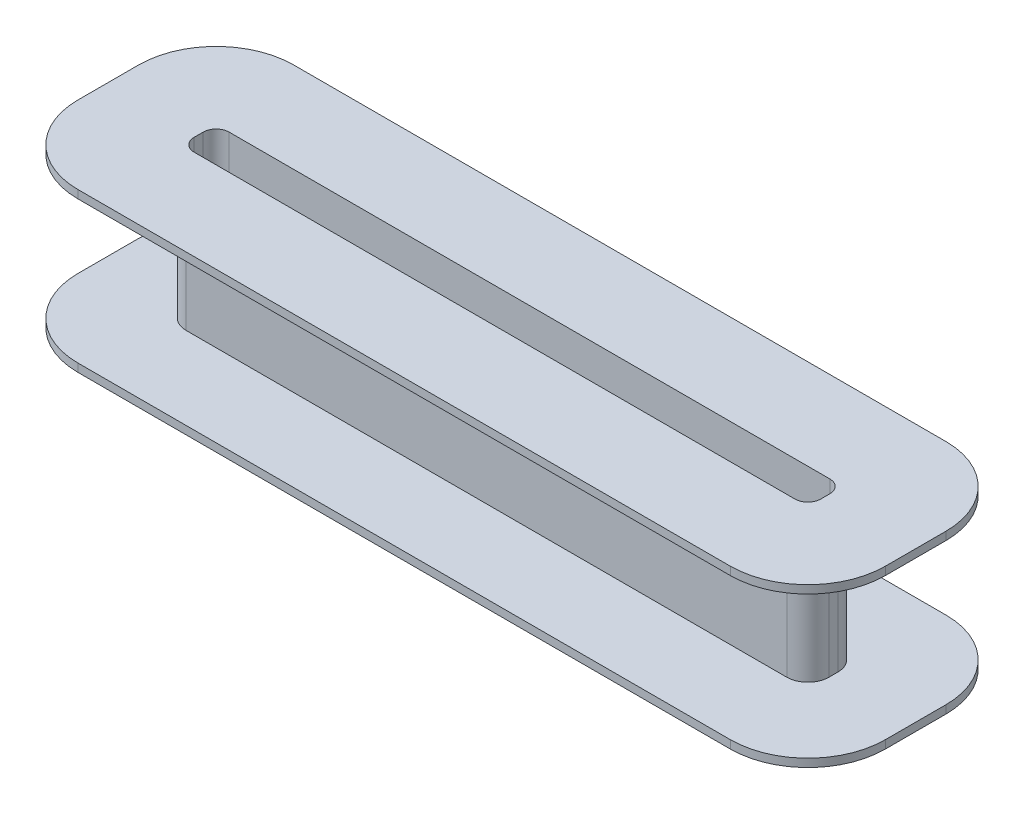
ISO-10303-21;
HEADER;
FILE_DESCRIPTION(('STEP AP214'),'2;1');
FILE_NAME('part.step','',(''),(''),'','','');
FILE_SCHEMA(('AUTOMOTIVE_DESIGN { 1 0 10303 214 1 1 1 1 }'));
ENDSEC;
DATA;
#1=APPLICATION_CONTEXT('core data for automotive mechanical design processes');
#2=APPLICATION_PROTOCOL_DEFINITION('international standard','automotive_design',2000,#1);
#3=PRODUCT_CONTEXT('',#1,'mechanical');
#4=PRODUCT('Part','Part','',(#3));
#5=PRODUCT_RELATED_PRODUCT_CATEGORY('part','',(#4));
#6=PRODUCT_DEFINITION_FORMATION('','',#4);
#7=PRODUCT_DEFINITION_CONTEXT('part definition',#1,'design');
#8=PRODUCT_DEFINITION('design','',#6,#7);
#9=PRODUCT_DEFINITION_SHAPE('','',#8);
#10=(LENGTH_UNIT() NAMED_UNIT(*) SI_UNIT(.MILLI.,.METRE.));
#11=(NAMED_UNIT(*) PLANE_ANGLE_UNIT() SI_UNIT($,.RADIAN.));
#12=(NAMED_UNIT(*) SI_UNIT($,.STERADIAN.) SOLID_ANGLE_UNIT());
#13=UNCERTAINTY_MEASURE_WITH_UNIT(LENGTH_MEASURE(1.E-05),#10,'distance_accuracy_value','');
#14=(GEOMETRIC_REPRESENTATION_CONTEXT(3) GLOBAL_UNCERTAINTY_ASSIGNED_CONTEXT((#13)) GLOBAL_UNIT_ASSIGNED_CONTEXT((#10,
#11,#12)) REPRESENTATION_CONTEXT('',''));
#15=CARTESIAN_POINT('',(0.,0.,0.));
#16=DIRECTION('',(0.,0.,1.));
#17=DIRECTION('',(1.,0.,0.));
#18=AXIS2_PLACEMENT_3D('',#15,#16,#17);
#19=CARTESIAN_POINT('',(0.,0.8,0.));
#20=DIRECTION('',(0.,-1.,0.));
#21=DIRECTION('',(0.,0.,-1.));
#22=AXIS2_PLACEMENT_3D('',#19,#20,#21);
#23=PLANE('',#22);
#24=DIRECTION('',(1.,0.,0.));
#25=VECTOR('',#24,1.);
#26=CARTESIAN_POINT('',(-39.6875,0.8,10.6045));
#27=LINE('',#26,#25);
#28=CARTESIAN_POINT('',(-32.0675,0.8,10.6045));
#29=VERTEX_POINT('',#28);
#30=CARTESIAN_POINT('',(32.0675,0.8,10.6045));
#31=VERTEX_POINT('',#30);
#32=EDGE_CURVE('E429',#29,#31,#27,.T.);
#33=ORIENTED_EDGE('',*,*,#32,.T.);
#34=CARTESIAN_POINT('',(32.0675,0.8,2.9845));
#35=DIRECTION('',(0.,-1.,0.));
#36=DIRECTION('',(0.,0.,-1.));
#37=AXIS2_PLACEMENT_3D('',#34,#35,#36);
#38=CIRCLE('',#37,7.62);
#39=CARTESIAN_POINT('',(39.6875,0.8,2.9845));
#40=VERTEX_POINT('',#39);
#41=EDGE_CURVE('E487',#31,#40,#38,.F.);
#42=ORIENTED_EDGE('',*,*,#41,.T.);
#43=DIRECTION('',(0.,0.,-1.));
#44=VECTOR('',#43,1.);
#45=CARTESIAN_POINT('',(39.6875,0.8,10.6045));
#46=LINE('',#45,#44);
#47=CARTESIAN_POINT('',(39.6875,0.8,-2.9845));
#48=VERTEX_POINT('',#47);
#49=EDGE_CURVE('E419',#40,#48,#46,.T.);
#50=ORIENTED_EDGE('',*,*,#49,.T.);
#51=CARTESIAN_POINT('',(32.0675,0.8,-2.9845));
#52=DIRECTION('',(0.,-1.,0.));
#53=DIRECTION('',(0.,0.,-1.));
#54=AXIS2_PLACEMENT_3D('',#51,#52,#53);
#55=CIRCLE('',#54,7.62);
#56=CARTESIAN_POINT('',(32.0675,0.8,-10.6045));
#57=VERTEX_POINT('',#56);
#58=EDGE_CURVE('E485',#48,#57,#55,.F.);
#59=ORIENTED_EDGE('',*,*,#58,.T.);
#60=DIRECTION('',(-1.,0.,0.));
#61=VECTOR('',#60,1.);
#62=CARTESIAN_POINT('',(-39.6875,0.8,-10.6045));
#63=LINE('',#62,#61);
#64=CARTESIAN_POINT('',(-32.0675,0.8,-10.6045));
#65=VERTEX_POINT('',#64);
#66=EDGE_CURVE('E422',#57,#65,#63,.T.);
#67=ORIENTED_EDGE('',*,*,#66,.T.);
#68=CARTESIAN_POINT('',(-32.0675,0.8,-2.9845));
#69=DIRECTION('',(0.,-1.,0.));
#70=DIRECTION('',(0.,0.,-1.));
#71=AXIS2_PLACEMENT_3D('',#68,#69,#70);
#72=CIRCLE('',#71,7.62);
#73=CARTESIAN_POINT('',(-39.6875,0.8,-2.9845));
#74=VERTEX_POINT('',#73);
#75=EDGE_CURVE('E481',#65,#74,#72,.F.);
#76=ORIENTED_EDGE('',*,*,#75,.T.);
#77=DIRECTION('',(0.,0.,1.));
#78=VECTOR('',#77,1.);
#79=CARTESIAN_POINT('',(-39.6875,0.8,10.6045));
#80=LINE('',#79,#78);
#81=CARTESIAN_POINT('',(-39.6875,0.8,2.9845));
#82=VERTEX_POINT('',#81);
#83=EDGE_CURVE('E426',#74,#82,#80,.T.);
#84=ORIENTED_EDGE('',*,*,#83,.T.);
#85=CARTESIAN_POINT('',(-32.0675,0.8,2.9845));
#86=DIRECTION('',(0.,-1.,0.));
#87=DIRECTION('',(0.,0.,-1.));
#88=AXIS2_PLACEMENT_3D('',#85,#86,#87);
#89=CIRCLE('',#88,7.62);
#90=EDGE_CURVE('E483',#82,#29,#89,.F.);
#91=ORIENTED_EDGE('',*,*,#90,.T.);
#92=EDGE_LOOP('',(#33,#42,#50,#59,#67,#76,#84,#91));
#93=FACE_BOUND('',#92,.T.);
#94=CARTESIAN_POINT('',(29.5275,0.8,-0.444500000000001));
#95=DIRECTION('',(0.,1.,0.));
#96=DIRECTION('',(0.,0.,1.));
#97=AXIS2_PLACEMENT_3D('',#94,#95,#96);
#98=CIRCLE('',#97,2.07);
#99=CARTESIAN_POINT('',(31.5975,0.8,-0.444500000000001));
#100=VERTEX_POINT('',#99);
#101=CARTESIAN_POINT('',(29.5275,0.8,-2.5145));
#102=VERTEX_POINT('',#101);
#103=EDGE_CURVE('E341',#100,#102,#98,.T.);
#104=ORIENTED_EDGE('',*,*,#103,.F.);
#105=DIRECTION('',(0.,0.,-1.));
#106=VECTOR('',#105,1.);
#107=CARTESIAN_POINT('',(31.5975,0.8,0.4445));
#108=LINE('',#107,#106);
#109=CARTESIAN_POINT('',(31.5975,0.8,0.4445));
#110=VERTEX_POINT('',#109);
#111=EDGE_CURVE('E346',#110,#100,#108,.T.);
#112=ORIENTED_EDGE('',*,*,#111,.F.);
#113=CARTESIAN_POINT('',(29.5275,0.8,0.4445));
#114=DIRECTION('',(0.,1.,0.));
#115=DIRECTION('',(0.,0.,1.));
#116=AXIS2_PLACEMENT_3D('',#113,#114,#115);
#117=CIRCLE('',#116,2.07);
#118=CARTESIAN_POINT('',(29.5275,0.8,2.5145));
#119=VERTEX_POINT('',#118);
#120=EDGE_CURVE('E381',#119,#110,#117,.T.);
#121=ORIENTED_EDGE('',*,*,#120,.F.);
#122=DIRECTION('',(1.,0.,0.));
#123=VECTOR('',#122,1.);
#124=CARTESIAN_POINT('',(-29.5275,0.8,2.5145));
#125=LINE('',#124,#123);
#126=CARTESIAN_POINT('',(-29.5275,0.8,2.5145));
#127=VERTEX_POINT('',#126);
#128=EDGE_CURVE('E378',#127,#119,#125,.T.);
#129=ORIENTED_EDGE('',*,*,#128,.F.);
#130=CARTESIAN_POINT('',(-29.5275,0.8,0.4445));
#131=DIRECTION('',(0.,1.,0.));
#132=DIRECTION('',(0.,0.,1.));
#133=AXIS2_PLACEMENT_3D('',#130,#131,#132);
#134=CIRCLE('',#133,2.07);
#135=CARTESIAN_POINT('',(-31.5975,0.8,0.4445));
#136=VERTEX_POINT('',#135);
#137=EDGE_CURVE('E375',#136,#127,#134,.T.);
#138=ORIENTED_EDGE('',*,*,#137,.F.);
#139=DIRECTION('',(0.,0.,1.));
#140=VECTOR('',#139,1.);
#141=CARTESIAN_POINT('',(-31.5975,0.8,-0.444500000000001));
#142=LINE('',#141,#140);
#143=CARTESIAN_POINT('',(-31.5975,0.8,-0.444500000000001));
#144=VERTEX_POINT('',#143);
#145=EDGE_CURVE('E372',#144,#136,#142,.T.);
#146=ORIENTED_EDGE('',*,*,#145,.F.);
#147=CARTESIAN_POINT('',(-29.5275,0.8,-0.444500000000001));
#148=DIRECTION('',(0.,1.,0.));
#149=DIRECTION('',(0.,0.,1.));
#150=AXIS2_PLACEMENT_3D('',#147,#148,#149);
#151=CIRCLE('',#150,2.07);
#152=CARTESIAN_POINT('',(-29.5275,0.8,-2.5145));
#153=VERTEX_POINT('',#152);
#154=EDGE_CURVE('E53',#153,#144,#151,.T.);
#155=ORIENTED_EDGE('',*,*,#154,.F.);
#156=DIRECTION('',(-1.,0.,0.));
#157=VECTOR('',#156,1.);
#158=CARTESIAN_POINT('',(29.5275,0.8,-2.5145));
#159=LINE('',#158,#157);
#160=EDGE_CURVE('E48',#102,#153,#159,.T.);
#161=ORIENTED_EDGE('',*,*,#160,.F.);
#162=EDGE_LOOP('',(#104,#112,#121,#129,#138,#146,#155,#161));
#163=FACE_BOUND('',#162,.T.);
#164=ADVANCED_FACE('F33',(#93,#163),#23,.F.);
#165=CARTESIAN_POINT('',(0.,0.,0.));
#166=DIRECTION('',(0.,-1.,0.));
#167=DIRECTION('',(0.,0.,-1.));
#168=AXIS2_PLACEMENT_3D('',#165,#166,#167);
#169=PLANE('',#168);
#170=DIRECTION('',(0.,0.,-1.));
#171=VECTOR('',#170,1.);
#172=CARTESIAN_POINT('',(39.6875,0.,10.6045));
#173=LINE('',#172,#171);
#174=CARTESIAN_POINT('',(39.6875,0.,2.9845));
#175=VERTEX_POINT('',#174);
#176=CARTESIAN_POINT('',(39.6875,0.,-2.9845));
#177=VERTEX_POINT('',#176);
#178=EDGE_CURVE('E418',#175,#177,#173,.T.);
#179=ORIENTED_EDGE('',*,*,#178,.F.);
#180=CARTESIAN_POINT('',(32.0675,0.,2.9845));
#181=DIRECTION('',(0.,-1.,0.));
#182=DIRECTION('',(0.,0.,-1.));
#183=AXIS2_PLACEMENT_3D('',#180,#181,#182);
#184=CIRCLE('',#183,7.62);
#185=CARTESIAN_POINT('',(32.0675,0.,10.6045));
#186=VERTEX_POINT('',#185);
#187=EDGE_CURVE('E474',#175,#186,#184,.T.);
#188=ORIENTED_EDGE('',*,*,#187,.T.);
#189=DIRECTION('',(1.,0.,0.));
#190=VECTOR('',#189,1.);
#191=CARTESIAN_POINT('',(-39.6875,0.,10.6045));
#192=LINE('',#191,#190);
#193=CARTESIAN_POINT('',(-32.0675,0.,10.6045));
#194=VERTEX_POINT('',#193);
#195=EDGE_CURVE('E423',#194,#186,#192,.T.);
#196=ORIENTED_EDGE('',*,*,#195,.F.);
#197=CARTESIAN_POINT('',(-32.0675,0.,2.9845));
#198=DIRECTION('',(0.,-1.,0.));
#199=DIRECTION('',(0.,0.,-1.));
#200=AXIS2_PLACEMENT_3D('',#197,#198,#199);
#201=CIRCLE('',#200,7.62);
#202=CARTESIAN_POINT('',(-39.6875,0.,2.9845));
#203=VERTEX_POINT('',#202);
#204=EDGE_CURVE('E470',#194,#203,#201,.T.);
#205=ORIENTED_EDGE('',*,*,#204,.T.);
#206=DIRECTION('',(0.,0.,1.));
#207=VECTOR('',#206,1.);
#208=CARTESIAN_POINT('',(-39.6875,0.,10.6045));
#209=LINE('',#208,#207);
#210=CARTESIAN_POINT('',(-39.6875,0.,-2.9845));
#211=VERTEX_POINT('',#210);
#212=EDGE_CURVE('E438',#211,#203,#209,.T.);
#213=ORIENTED_EDGE('',*,*,#212,.F.);
#214=CARTESIAN_POINT('',(-32.0675,0.,-2.9845));
#215=DIRECTION('',(0.,-1.,0.));
#216=DIRECTION('',(0.,0.,-1.));
#217=AXIS2_PLACEMENT_3D('',#214,#215,#216);
#218=CIRCLE('',#217,7.62);
#219=CARTESIAN_POINT('',(-32.0675,0.,-10.6045));
#220=VERTEX_POINT('',#219);
#221=EDGE_CURVE('E468',#211,#220,#218,.T.);
#222=ORIENTED_EDGE('',*,*,#221,.T.);
#223=DIRECTION('',(-1.,0.,0.));
#224=VECTOR('',#223,1.);
#225=CARTESIAN_POINT('',(-39.6875,0.,-10.6045));
#226=LINE('',#225,#224);
#227=CARTESIAN_POINT('',(32.0675,0.,-10.6045));
#228=VERTEX_POINT('',#227);
#229=EDGE_CURVE('E435',#228,#220,#226,.T.);
#230=ORIENTED_EDGE('',*,*,#229,.F.);
#231=CARTESIAN_POINT('',(32.0675,0.,-2.9845));
#232=DIRECTION('',(0.,-1.,0.));
#233=DIRECTION('',(0.,0.,-1.));
#234=AXIS2_PLACEMENT_3D('',#231,#232,#233);
#235=CIRCLE('',#234,7.62);
#236=EDGE_CURVE('E472',#228,#177,#235,.T.);
#237=ORIENTED_EDGE('',*,*,#236,.T.);
#238=EDGE_LOOP('',(#179,#188,#196,#205,#213,#222,#230,#237));
#239=FACE_BOUND('',#238,.T.);
#240=DIRECTION('',(0.,0.,1.));
#241=VECTOR('',#240,1.);
#242=CARTESIAN_POINT('',(-30.7975,0.,1.7145));
#243=LINE('',#242,#241);
#244=CARTESIAN_POINT('',(-30.7975,0.,-0.444500000000001));
#245=VERTEX_POINT('',#244);
#246=CARTESIAN_POINT('',(-30.7975,0.,0.4445));
#247=VERTEX_POINT('',#246);
#248=EDGE_CURVE('E412',#245,#247,#243,.T.);
#249=ORIENTED_EDGE('',*,*,#248,.T.);
#250=CARTESIAN_POINT('',(-29.5275,0.,0.4445));
#251=DIRECTION('',(0.,-1.,0.));
#252=DIRECTION('',(0.,0.,-1.));
#253=AXIS2_PLACEMENT_3D('',#250,#251,#252);
#254=CIRCLE('',#253,1.27);
#255=CARTESIAN_POINT('',(-29.5275,0.,1.7145));
#256=VERTEX_POINT('',#255);
#257=EDGE_CURVE('E461',#247,#256,#254,.F.);
#258=ORIENTED_EDGE('',*,*,#257,.T.);
#259=DIRECTION('',(1.,0.,0.));
#260=VECTOR('',#259,1.);
#261=CARTESIAN_POINT('',(-30.7975,0.,1.7145));
#262=LINE('',#261,#260);
#263=CARTESIAN_POINT('',(29.5275,0.,1.7145));
#264=VERTEX_POINT('',#263);
#265=EDGE_CURVE('E415',#256,#264,#262,.T.);
#266=ORIENTED_EDGE('',*,*,#265,.T.);
#267=CARTESIAN_POINT('',(29.5275,0.,0.4445));
#268=DIRECTION('',(0.,-1.,0.));
#269=DIRECTION('',(0.,0.,-1.));
#270=AXIS2_PLACEMENT_3D('',#267,#268,#269);
#271=CIRCLE('',#270,1.27);
#272=CARTESIAN_POINT('',(30.7975,0.,0.4445));
#273=VERTEX_POINT('',#272);
#274=EDGE_CURVE('E457',#264,#273,#271,.F.);
#275=ORIENTED_EDGE('',*,*,#274,.T.);
#276=DIRECTION('',(0.,0.,-1.));
#277=VECTOR('',#276,1.);
#278=CARTESIAN_POINT('',(30.7975,0.,1.7145));
#279=LINE('',#278,#277);
#280=CARTESIAN_POINT('',(30.7975,0.,-0.444500000000001));
#281=VERTEX_POINT('',#280);
#282=EDGE_CURVE('E408',#273,#281,#279,.T.);
#283=ORIENTED_EDGE('',*,*,#282,.T.);
#284=CARTESIAN_POINT('',(29.5275,0.,-0.444500000000001));
#285=DIRECTION('',(0.,-1.,0.));
#286=DIRECTION('',(0.,0.,-1.));
#287=AXIS2_PLACEMENT_3D('',#284,#285,#286);
#288=CIRCLE('',#287,1.27);
#289=CARTESIAN_POINT('',(29.5275,0.,-1.7145));
#290=VERTEX_POINT('',#289);
#291=EDGE_CURVE('E455',#281,#290,#288,.F.);
#292=ORIENTED_EDGE('',*,*,#291,.T.);
#293=DIRECTION('',(-1.,0.,0.));
#294=VECTOR('',#293,1.);
#295=CARTESIAN_POINT('',(-30.7975,0.,-1.7145));
#296=LINE('',#295,#294);
#297=CARTESIAN_POINT('',(-29.5275,0.,-1.7145));
#298=VERTEX_POINT('',#297);
#299=EDGE_CURVE('E248',#290,#298,#296,.T.);
#300=ORIENTED_EDGE('',*,*,#299,.T.);
#301=CARTESIAN_POINT('',(-29.5275,0.,-0.444500000000001));
#302=DIRECTION('',(0.,-1.,0.));
#303=DIRECTION('',(0.,0.,-1.));
#304=AXIS2_PLACEMENT_3D('',#301,#302,#303);
#305=CIRCLE('',#304,1.27);
#306=EDGE_CURVE('E459',#298,#245,#305,.F.);
#307=ORIENTED_EDGE('',*,*,#306,.T.);
#308=EDGE_LOOP('',(#249,#258,#266,#275,#283,#292,#300,#307));
#309=FACE_BOUND('',#308,.T.);
#310=ADVANCED_FACE('F504',(#239,#309),#169,.T.);
#311=CARTESIAN_POINT('',(39.6875,0.8,10.6045));
#312=DIRECTION('',(-1.,0.,0.));
#313=DIRECTION('',(0.,0.,1.));
#314=AXIS2_PLACEMENT_3D('',#311,#312,#313);
#315=PLANE('',#314);
#316=ORIENTED_EDGE('',*,*,#49,.F.);
#317=DIRECTION('',(0.,-1.,0.));
#318=VECTOR('',#317,1.);
#319=CARTESIAN_POINT('',(39.6875,0.8,2.9845));
#320=LINE('',#319,#318);
#321=EDGE_CURVE('E465',#40,#175,#320,.T.);
#322=ORIENTED_EDGE('',*,*,#321,.T.);
#323=ORIENTED_EDGE('',*,*,#178,.T.);
#324=DIRECTION('',(0.,-1.,0.));
#325=VECTOR('',#324,1.);
#326=CARTESIAN_POINT('',(39.6875,0.8,-2.9845));
#327=LINE('',#326,#325);
#328=EDGE_CURVE('E463',#177,#48,#327,.F.);
#329=ORIENTED_EDGE('',*,*,#328,.T.);
#330=EDGE_LOOP('',(#316,#322,#323,#329));
#331=FACE_BOUND('',#330,.T.);
#332=ADVANCED_FACE('F523',(#331),#315,.F.);
#333=CARTESIAN_POINT('',(-39.6875,0.8,-10.6045));
#334=DIRECTION('',(0.,0.,1.));
#335=DIRECTION('',(1.,0.,0.));
#336=AXIS2_PLACEMENT_3D('',#333,#334,#335);
#337=PLANE('',#336);
#338=ORIENTED_EDGE('',*,*,#66,.F.);
#339=DIRECTION('',(0.,-1.,0.));
#340=VECTOR('',#339,1.);
#341=CARTESIAN_POINT('',(32.0675,0.8,-10.6045));
#342=LINE('',#341,#340);
#343=EDGE_CURVE('E491',#57,#228,#342,.T.);
#344=ORIENTED_EDGE('',*,*,#343,.T.);
#345=ORIENTED_EDGE('',*,*,#229,.T.);
#346=DIRECTION('',(0.,-1.,0.));
#347=VECTOR('',#346,1.);
#348=CARTESIAN_POINT('',(-32.0675,0.8,-10.6045));
#349=LINE('',#348,#347);
#350=EDGE_CURVE('E489',#220,#65,#349,.F.);
#351=ORIENTED_EDGE('',*,*,#350,.T.);
#352=EDGE_LOOP('',(#338,#344,#345,#351));
#353=FACE_BOUND('',#352,.T.);
#354=ADVANCED_FACE('F531',(#353),#337,.F.);
#355=CARTESIAN_POINT('',(-39.6875,0.8,10.6045));
#356=DIRECTION('',(1.,0.,0.));
#357=DIRECTION('',(0.,0.,-1.));
#358=AXIS2_PLACEMENT_3D('',#355,#356,#357);
#359=PLANE('',#358);
#360=ORIENTED_EDGE('',*,*,#212,.T.);
#361=DIRECTION('',(0.,-1.,0.));
#362=VECTOR('',#361,1.);
#363=CARTESIAN_POINT('',(-39.6875,0.8,2.9845));
#364=LINE('',#363,#362);
#365=EDGE_CURVE('E11',#203,#82,#364,.F.);
#366=ORIENTED_EDGE('',*,*,#365,.T.);
#367=ORIENTED_EDGE('',*,*,#83,.F.);
#368=DIRECTION('',(0.,-1.,0.));
#369=VECTOR('',#368,1.);
#370=CARTESIAN_POINT('',(-39.6875,0.8,-2.9845));
#371=LINE('',#370,#369);
#372=EDGE_CURVE('E41',#74,#211,#371,.T.);
#373=ORIENTED_EDGE('',*,*,#372,.T.);
#374=EDGE_LOOP('',(#360,#366,#367,#373));
#375=FACE_BOUND('',#374,.T.);
#376=ADVANCED_FACE('F498',(#375),#359,.F.);
#377=CARTESIAN_POINT('',(-39.6875,0.8,10.6045));
#378=DIRECTION('',(0.,0.,-1.));
#379=DIRECTION('',(-1.,0.,0.));
#380=AXIS2_PLACEMENT_3D('',#377,#378,#379);
#381=PLANE('',#380);
#382=ORIENTED_EDGE('',*,*,#195,.T.);
#383=DIRECTION('',(0.,-1.,0.));
#384=VECTOR('',#383,1.);
#385=CARTESIAN_POINT('',(32.0675,0.8,10.6045));
#386=LINE('',#385,#384);
#387=EDGE_CURVE('E479',#186,#31,#386,.F.);
#388=ORIENTED_EDGE('',*,*,#387,.T.);
#389=ORIENTED_EDGE('',*,*,#32,.F.);
#390=DIRECTION('',(0.,-1.,0.));
#391=VECTOR('',#390,1.);
#392=CARTESIAN_POINT('',(-32.0675,0.8,10.6045));
#393=LINE('',#392,#391);
#394=EDGE_CURVE('E476',#29,#194,#393,.T.);
#395=ORIENTED_EDGE('',*,*,#394,.T.);
#396=EDGE_LOOP('',(#382,#388,#389,#395));
#397=FACE_BOUND('',#396,.T.);
#398=ADVANCED_FACE('F514',(#397),#381,.F.);
#399=CARTESIAN_POINT('',(30.7975,0.8,1.7145));
#400=DIRECTION('',(-1.,0.,0.));
#401=DIRECTION('',(0.,0.,1.));
#402=AXIS2_PLACEMENT_3D('',#399,#400,#401);
#403=PLANE('',#402);
#404=DIRECTION('',(0.,-1.,0.));
#405=VECTOR('',#404,1.);
#406=CARTESIAN_POINT('',(30.7975,0.8,0.4445));
#407=LINE('',#406,#405);
#408=CARTESIAN_POINT('',(30.7975,15.57,0.4445));
#409=VERTEX_POINT('',#408);
#410=EDGE_CURVE('E432',#273,#409,#407,.F.);
#411=ORIENTED_EDGE('',*,*,#410,.T.);
#412=DIRECTION('',(0.,0.,-1.));
#413=VECTOR('',#412,1.);
#414=CARTESIAN_POINT('',(30.7975,15.57,0.4445));
#415=LINE('',#414,#413);
#416=CARTESIAN_POINT('',(30.7975,15.57,-0.444500000000001));
#417=VERTEX_POINT('',#416);
#418=EDGE_CURVE('E281',#409,#417,#415,.T.);
#419=ORIENTED_EDGE('',*,*,#418,.T.);
#420=DIRECTION('',(0.,-1.,0.));
#421=VECTOR('',#420,1.);
#422=CARTESIAN_POINT('',(30.7975,0.,-0.444500000000001));
#423=LINE('',#422,#421);
#424=EDGE_CURVE('E257',#417,#281,#423,.T.);
#425=ORIENTED_EDGE('',*,*,#424,.T.);
#426=ORIENTED_EDGE('',*,*,#282,.F.);
#427=EDGE_LOOP('',(#411,#419,#425,#426));
#428=FACE_BOUND('',#427,.T.);
#429=ADVANCED_FACE('F549',(#428),#403,.T.);
#430=CARTESIAN_POINT('',(-30.7975,0.8,-1.7145));
#431=DIRECTION('',(0.,0.,1.));
#432=DIRECTION('',(1.,0.,0.));
#433=AXIS2_PLACEMENT_3D('',#430,#431,#432);
#434=PLANE('',#433);
#435=ORIENTED_EDGE('',*,*,#299,.F.);
#436=DIRECTION('',(0.,-1.,0.));
#437=VECTOR('',#436,1.);
#438=CARTESIAN_POINT('',(29.5275,0.8,-1.7145));
#439=LINE('',#438,#437);
#440=CARTESIAN_POINT('',(29.5275,15.57,-1.7145));
#441=VERTEX_POINT('',#440);
#442=EDGE_CURVE('E240',#290,#441,#439,.F.);
#443=ORIENTED_EDGE('',*,*,#442,.T.);
#444=DIRECTION('',(-1.,0.,0.));
#445=VECTOR('',#444,1.);
#446=CARTESIAN_POINT('',(29.5275,15.57,-1.7145));
#447=LINE('',#446,#445);
#448=CARTESIAN_POINT('',(-29.5275,15.57,-1.7145));
#449=VERTEX_POINT('',#448);
#450=EDGE_CURVE('E245',#441,#449,#447,.T.);
#451=ORIENTED_EDGE('',*,*,#450,.T.);
#452=DIRECTION('',(0.,-1.,0.));
#453=VECTOR('',#452,1.);
#454=CARTESIAN_POINT('',(-29.5275,0.,-1.7145));
#455=LINE('',#454,#453);
#456=EDGE_CURVE('E251',#449,#298,#455,.T.);
#457=ORIENTED_EDGE('',*,*,#456,.T.);
#458=EDGE_LOOP('',(#435,#443,#451,#457));
#459=FACE_BOUND('',#458,.T.);
#460=ADVANCED_FACE('F242',(#459),#434,.T.);
#461=CARTESIAN_POINT('',(-30.7975,0.8,1.7145));
#462=DIRECTION('',(1.,0.,0.));
#463=DIRECTION('',(0.,0.,-1.));
#464=AXIS2_PLACEMENT_3D('',#461,#462,#463);
#465=PLANE('',#464);
#466=ORIENTED_EDGE('',*,*,#248,.F.);
#467=DIRECTION('',(0.,-1.,0.));
#468=VECTOR('',#467,1.);
#469=CARTESIAN_POINT('',(-30.7975,0.8,-0.444500000000001));
#470=LINE('',#469,#468);
#471=CARTESIAN_POINT('',(-30.7975,15.57,-0.444500000000001));
#472=VERTEX_POINT('',#471);
#473=EDGE_CURVE('E453',#245,#472,#470,.F.);
#474=ORIENTED_EDGE('',*,*,#473,.T.);
#475=DIRECTION('',(0.,0.,1.));
#476=VECTOR('',#475,1.);
#477=CARTESIAN_POINT('',(-30.7975,15.57,-0.444500000000001));
#478=LINE('',#477,#476);
#479=CARTESIAN_POINT('',(-30.7975,15.57,0.4445));
#480=VERTEX_POINT('',#479);
#481=EDGE_CURVE('E267',#472,#480,#478,.T.);
#482=ORIENTED_EDGE('',*,*,#481,.T.);
#483=DIRECTION('',(0.,-1.,0.));
#484=VECTOR('',#483,1.);
#485=CARTESIAN_POINT('',(-30.7975,0.,0.4445));
#486=LINE('',#485,#484);
#487=EDGE_CURVE('E450',#480,#247,#486,.T.);
#488=ORIENTED_EDGE('',*,*,#487,.T.);
#489=EDGE_LOOP('',(#466,#474,#482,#488));
#490=FACE_BOUND('',#489,.T.);
#491=ADVANCED_FACE('F613',(#490),#465,.T.);
#492=CARTESIAN_POINT('',(-30.7975,0.8,1.7145));
#493=DIRECTION('',(0.,0.,-1.));
#494=DIRECTION('',(-1.,0.,0.));
#495=AXIS2_PLACEMENT_3D('',#492,#493,#494);
#496=PLANE('',#495);
#497=DIRECTION('',(0.,-1.,0.));
#498=VECTOR('',#497,1.);
#499=CARTESIAN_POINT('',(-29.5275,0.8,1.7145));
#500=LINE('',#499,#498);
#501=CARTESIAN_POINT('',(-29.5275,15.57,1.7145));
#502=VERTEX_POINT('',#501);
#503=EDGE_CURVE('E250',#256,#502,#500,.F.);
#504=ORIENTED_EDGE('',*,*,#503,.T.);
#505=DIRECTION('',(1.,0.,0.));
#506=VECTOR('',#505,1.);
#507=CARTESIAN_POINT('',(-29.5275,15.57,1.7145));
#508=LINE('',#507,#506);
#509=CARTESIAN_POINT('',(29.5275,15.57,1.7145));
#510=VERTEX_POINT('',#509);
#511=EDGE_CURVE('E275',#502,#510,#508,.T.);
#512=ORIENTED_EDGE('',*,*,#511,.T.);
#513=DIRECTION('',(0.,-1.,0.));
#514=VECTOR('',#513,1.);
#515=CARTESIAN_POINT('',(29.5275,0.,1.7145));
#516=LINE('',#515,#514);
#517=EDGE_CURVE('E447',#510,#264,#516,.T.);
#518=ORIENTED_EDGE('',*,*,#517,.T.);
#519=ORIENTED_EDGE('',*,*,#265,.F.);
#520=EDGE_LOOP('',(#504,#512,#518,#519));
#521=FACE_BOUND('',#520,.T.);
#522=ADVANCED_FACE('F563',(#521),#496,.T.);
#523=CARTESIAN_POINT('',(29.5275,0.8,-0.444500000000001));
#524=DIRECTION('',(0.,1.,0.));
#525=DIRECTION('',(0.,0.,1.));
#526=AXIS2_PLACEMENT_3D('',#523,#524,#525);
#527=CYLINDRICAL_SURFACE('',#526,1.27);
#528=ORIENTED_EDGE('',*,*,#424,.F.);
#529=CARTESIAN_POINT('',(29.5275,15.57,-0.444500000000001));
#530=DIRECTION('',(0.,1.,0.));
#531=DIRECTION('',(0.,0.,1.));
#532=AXIS2_PLACEMENT_3D('',#529,#530,#531);
#533=CIRCLE('',#532,1.27);
#534=EDGE_CURVE('E254',#417,#441,#533,.T.);
#535=ORIENTED_EDGE('',*,*,#534,.T.);
#536=ORIENTED_EDGE('',*,*,#442,.F.);
#537=ORIENTED_EDGE('',*,*,#291,.F.);
#538=EDGE_LOOP('',(#528,#535,#536,#537));
#539=FACE_BOUND('',#538,.T.);
#540=ADVANCED_FACE('F255',(#539),#527,.F.);
#541=CARTESIAN_POINT('',(29.5275,0.8,0.4445));
#542=DIRECTION('',(0.,1.,0.));
#543=DIRECTION('',(0.,0.,1.));
#544=AXIS2_PLACEMENT_3D('',#541,#542,#543);
#545=CYLINDRICAL_SURFACE('',#544,1.27);
#546=ORIENTED_EDGE('',*,*,#517,.F.);
#547=CARTESIAN_POINT('',(29.5275,15.57,0.4445));
#548=DIRECTION('',(0.,1.,0.));
#549=DIRECTION('',(0.,0.,1.));
#550=AXIS2_PLACEMENT_3D('',#547,#548,#549);
#551=CIRCLE('',#550,1.27);
#552=EDGE_CURVE('E278',#510,#409,#551,.T.);
#553=ORIENTED_EDGE('',*,*,#552,.T.);
#554=ORIENTED_EDGE('',*,*,#410,.F.);
#555=ORIENTED_EDGE('',*,*,#274,.F.);
#556=EDGE_LOOP('',(#546,#553,#554,#555));
#557=FACE_BOUND('',#556,.T.);
#558=ADVANCED_FACE('F562',(#557),#545,.F.);
#559=CARTESIAN_POINT('',(-29.5275,0.8,-0.444500000000001));
#560=DIRECTION('',(0.,1.,0.));
#561=DIRECTION('',(0.,0.,1.));
#562=AXIS2_PLACEMENT_3D('',#559,#560,#561);
#563=CYLINDRICAL_SURFACE('',#562,1.27);
#564=ORIENTED_EDGE('',*,*,#456,.F.);
#565=CARTESIAN_POINT('',(-29.5275,15.57,-0.444500000000001));
#566=DIRECTION('',(0.,1.,0.));
#567=DIRECTION('',(0.,0.,1.));
#568=AXIS2_PLACEMENT_3D('',#565,#566,#567);
#569=CIRCLE('',#568,1.27);
#570=EDGE_CURVE('E265',#449,#472,#569,.T.);
#571=ORIENTED_EDGE('',*,*,#570,.T.);
#572=ORIENTED_EDGE('',*,*,#473,.F.);
#573=ORIENTED_EDGE('',*,*,#306,.F.);
#574=EDGE_LOOP('',(#564,#571,#572,#573));
#575=FACE_BOUND('',#574,.T.);
#576=ADVANCED_FACE('F566',(#575),#563,.F.);
#577=CARTESIAN_POINT('',(-29.5275,0.8,0.4445));
#578=DIRECTION('',(0.,1.,0.));
#579=DIRECTION('',(0.,0.,1.));
#580=AXIS2_PLACEMENT_3D('',#577,#578,#579);
#581=CYLINDRICAL_SURFACE('',#580,1.27);
#582=ORIENTED_EDGE('',*,*,#487,.F.);
#583=CARTESIAN_POINT('',(-29.5275,15.57,0.4445));
#584=DIRECTION('',(0.,1.,0.));
#585=DIRECTION('',(0.,0.,1.));
#586=AXIS2_PLACEMENT_3D('',#583,#584,#585);
#587=CIRCLE('',#586,1.27);
#588=EDGE_CURVE('E272',#480,#502,#587,.T.);
#589=ORIENTED_EDGE('',*,*,#588,.T.);
#590=ORIENTED_EDGE('',*,*,#503,.F.);
#591=ORIENTED_EDGE('',*,*,#257,.F.);
#592=EDGE_LOOP('',(#582,#589,#590,#591));
#593=FACE_BOUND('',#592,.T.);
#594=ADVANCED_FACE('F570',(#593),#581,.F.);
#595=CARTESIAN_POINT('',(32.0675,0.8,2.9845));
#596=DIRECTION('',(0.,-1.,0.));
#597=DIRECTION('',(0.,0.,-1.));
#598=AXIS2_PLACEMENT_3D('',#595,#596,#597);
#599=CYLINDRICAL_SURFACE('',#598,7.62);
#600=ORIENTED_EDGE('',*,*,#41,.F.);
#601=ORIENTED_EDGE('',*,*,#387,.F.);
#602=ORIENTED_EDGE('',*,*,#187,.F.);
#603=ORIENTED_EDGE('',*,*,#321,.F.);
#604=EDGE_LOOP('',(#600,#601,#602,#603));
#605=FACE_BOUND('',#604,.T.);
#606=ADVANCED_FACE('F521',(#605),#599,.T.);
#607=CARTESIAN_POINT('',(32.0675,0.8,-2.9845));
#608=DIRECTION('',(0.,-1.,0.));
#609=DIRECTION('',(0.,0.,-1.));
#610=AXIS2_PLACEMENT_3D('',#607,#608,#609);
#611=CYLINDRICAL_SURFACE('',#610,7.62);
#612=ORIENTED_EDGE('',*,*,#58,.F.);
#613=ORIENTED_EDGE('',*,*,#328,.F.);
#614=ORIENTED_EDGE('',*,*,#236,.F.);
#615=ORIENTED_EDGE('',*,*,#343,.F.);
#616=EDGE_LOOP('',(#612,#613,#614,#615));
#617=FACE_BOUND('',#616,.T.);
#618=ADVANCED_FACE('F528',(#617),#611,.T.);
#619=CARTESIAN_POINT('',(-32.0675,0.8,2.9845));
#620=DIRECTION('',(0.,-1.,0.));
#621=DIRECTION('',(0.,0.,-1.));
#622=AXIS2_PLACEMENT_3D('',#619,#620,#621);
#623=CYLINDRICAL_SURFACE('',#622,7.62);
#624=ORIENTED_EDGE('',*,*,#90,.F.);
#625=ORIENTED_EDGE('',*,*,#365,.F.);
#626=ORIENTED_EDGE('',*,*,#204,.F.);
#627=ORIENTED_EDGE('',*,*,#394,.F.);
#628=EDGE_LOOP('',(#624,#625,#626,#627));
#629=FACE_BOUND('',#628,.T.);
#630=ADVANCED_FACE('F511',(#629),#623,.T.);
#631=CARTESIAN_POINT('',(-32.0675,0.8,-2.9845));
#632=DIRECTION('',(0.,-1.,0.));
#633=DIRECTION('',(0.,0.,-1.));
#634=AXIS2_PLACEMENT_3D('',#631,#632,#633);
#635=CYLINDRICAL_SURFACE('',#634,7.62);
#636=ORIENTED_EDGE('',*,*,#75,.F.);
#637=ORIENTED_EDGE('',*,*,#350,.F.);
#638=ORIENTED_EDGE('',*,*,#221,.F.);
#639=ORIENTED_EDGE('',*,*,#372,.F.);
#640=EDGE_LOOP('',(#636,#637,#638,#639));
#641=FACE_BOUND('',#640,.T.);
#642=ADVANCED_FACE('F35',(#641),#635,.T.);
#643=CARTESIAN_POINT('',(29.5275,14.77,-0.444500000000001));
#644=DIRECTION('',(0.,-1.,0.));
#645=DIRECTION('',(0.,0.,-1.));
#646=AXIS2_PLACEMENT_3D('',#643,#644,#645);
#647=CYLINDRICAL_SURFACE('',#646,2.07);
#648=ORIENTED_EDGE('',*,*,#103,.T.);
#649=DIRECTION('',(0.,-1.,0.));
#650=VECTOR('',#649,1.);
#651=CARTESIAN_POINT('',(29.5275,14.77,-2.5145));
#652=LINE('',#651,#650);
#653=CARTESIAN_POINT('',(29.5275,14.77,-2.5145));
#654=VERTEX_POINT('',#653);
#655=EDGE_CURVE('E406',#654,#102,#652,.T.);
#656=ORIENTED_EDGE('',*,*,#655,.F.);
#657=CARTESIAN_POINT('',(29.5275,14.77,-0.444500000000001));
#658=DIRECTION('',(0.,1.,0.));
#659=DIRECTION('',(0.,0.,1.));
#660=AXIS2_PLACEMENT_3D('',#657,#658,#659);
#661=CIRCLE('',#660,2.07);
#662=CARTESIAN_POINT('',(31.5975,14.77,-0.444500000000001));
#663=VERTEX_POINT('',#662);
#664=EDGE_CURVE('E342',#663,#654,#661,.T.);
#665=ORIENTED_EDGE('',*,*,#664,.F.);
#666=DIRECTION('',(0.,-1.,0.));
#667=VECTOR('',#666,1.);
#668=CARTESIAN_POINT('',(31.5975,14.77,-0.444500000000001));
#669=LINE('',#668,#667);
#670=EDGE_CURVE('E367',#663,#100,#669,.T.);
#671=ORIENTED_EDGE('',*,*,#670,.T.);
#672=EDGE_LOOP('',(#648,#656,#665,#671));
#673=FACE_BOUND('',#672,.T.);
#674=ADVANCED_FACE('F534',(#673),#647,.T.);
#675=CARTESIAN_POINT('',(29.5275,14.77,-2.5145));
#676=DIRECTION('',(0.,0.,1.));
#677=DIRECTION('',(1.,0.,0.));
#678=AXIS2_PLACEMENT_3D('',#675,#676,#677);
#679=PLANE('',#678);
#680=ORIENTED_EDGE('',*,*,#160,.T.);
#681=DIRECTION('',(0.,-1.,0.));
#682=VECTOR('',#681,1.);
#683=CARTESIAN_POINT('',(-29.5275,14.77,-2.5145));
#684=LINE('',#683,#682);
#685=CARTESIAN_POINT('',(-29.5275,14.77,-2.5145));
#686=VERTEX_POINT('',#685);
#687=EDGE_CURVE('E403',#686,#153,#684,.T.);
#688=ORIENTED_EDGE('',*,*,#687,.F.);
#689=DIRECTION('',(-1.,0.,0.));
#690=VECTOR('',#689,1.);
#691=CARTESIAN_POINT('',(29.5275,14.77,-2.5145));
#692=LINE('',#691,#690);
#693=EDGE_CURVE('E345',#654,#686,#692,.T.);
#694=ORIENTED_EDGE('',*,*,#693,.F.);
#695=ORIENTED_EDGE('',*,*,#655,.T.);
#696=EDGE_LOOP('',(#680,#688,#694,#695));
#697=FACE_BOUND('',#696,.T.);
#698=ADVANCED_FACE('F539',(#697),#679,.F.);
#699=CARTESIAN_POINT('',(-29.5275,14.77,-0.444500000000001));
#700=DIRECTION('',(0.,-1.,0.));
#701=DIRECTION('',(0.,0.,-1.));
#702=AXIS2_PLACEMENT_3D('',#699,#700,#701);
#703=CYLINDRICAL_SURFACE('',#702,2.07);
#704=ORIENTED_EDGE('',*,*,#154,.T.);
#705=DIRECTION('',(0.,-1.,0.));
#706=VECTOR('',#705,1.);
#707=CARTESIAN_POINT('',(-31.5975,14.77,-0.444500000000001));
#708=LINE('',#707,#706);
#709=CARTESIAN_POINT('',(-31.5975,14.77,-0.444500000000001));
#710=VERTEX_POINT('',#709);
#711=EDGE_CURVE('E400',#710,#144,#708,.T.);
#712=ORIENTED_EDGE('',*,*,#711,.F.);
#713=CARTESIAN_POINT('',(-29.5275,14.77,-0.444500000000001));
#714=DIRECTION('',(0.,1.,0.));
#715=DIRECTION('',(0.,0.,1.));
#716=AXIS2_PLACEMENT_3D('',#713,#714,#715);
#717=CIRCLE('',#716,2.07);
#718=EDGE_CURVE('E349',#686,#710,#717,.T.);
#719=ORIENTED_EDGE('',*,*,#718,.F.);
#720=ORIENTED_EDGE('',*,*,#687,.T.);
#721=EDGE_LOOP('',(#704,#712,#719,#720));
#722=FACE_BOUND('',#721,.T.);
#723=ADVANCED_FACE('F677',(#722),#703,.T.);
#724=CARTESIAN_POINT('',(-31.5975,14.77,-0.444500000000001));
#725=DIRECTION('',(1.,0.,0.));
#726=DIRECTION('',(0.,0.,-1.));
#727=AXIS2_PLACEMENT_3D('',#724,#725,#726);
#728=PLANE('',#727);
#729=ORIENTED_EDGE('',*,*,#145,.T.);
#730=DIRECTION('',(0.,-1.,0.));
#731=VECTOR('',#730,1.);
#732=CARTESIAN_POINT('',(-31.5975,14.77,0.4445));
#733=LINE('',#732,#731);
#734=CARTESIAN_POINT('',(-31.5975,14.77,0.4445));
#735=VERTEX_POINT('',#734);
#736=EDGE_CURVE('E397',#735,#136,#733,.T.);
#737=ORIENTED_EDGE('',*,*,#736,.F.);
#738=DIRECTION('',(0.,0.,1.));
#739=VECTOR('',#738,1.);
#740=CARTESIAN_POINT('',(-31.5975,14.77,-0.444500000000001));
#741=LINE('',#740,#739);
#742=EDGE_CURVE('E352',#710,#735,#741,.T.);
#743=ORIENTED_EDGE('',*,*,#742,.F.);
#744=ORIENTED_EDGE('',*,*,#711,.T.);
#745=EDGE_LOOP('',(#729,#737,#743,#744));
#746=FACE_BOUND('',#745,.T.);
#747=ADVANCED_FACE('F687',(#746),#728,.F.);
#748=CARTESIAN_POINT('',(-29.5275,14.77,0.4445));
#749=DIRECTION('',(0.,-1.,0.));
#750=DIRECTION('',(0.,0.,-1.));
#751=AXIS2_PLACEMENT_3D('',#748,#749,#750);
#752=CYLINDRICAL_SURFACE('',#751,2.07);
#753=ORIENTED_EDGE('',*,*,#137,.T.);
#754=DIRECTION('',(0.,-1.,0.));
#755=VECTOR('',#754,1.);
#756=CARTESIAN_POINT('',(-29.5275,14.77,2.5145));
#757=LINE('',#756,#755);
#758=CARTESIAN_POINT('',(-29.5275,14.77,2.5145));
#759=VERTEX_POINT('',#758);
#760=EDGE_CURVE('E394',#759,#127,#757,.T.);
#761=ORIENTED_EDGE('',*,*,#760,.F.);
#762=CARTESIAN_POINT('',(-29.5275,14.77,0.4445));
#763=DIRECTION('',(0.,1.,0.));
#764=DIRECTION('',(0.,0.,1.));
#765=AXIS2_PLACEMENT_3D('',#762,#763,#764);
#766=CIRCLE('',#765,2.07);
#767=EDGE_CURVE('E355',#735,#759,#766,.T.);
#768=ORIENTED_EDGE('',*,*,#767,.F.);
#769=ORIENTED_EDGE('',*,*,#736,.T.);
#770=EDGE_LOOP('',(#753,#761,#768,#769));
#771=FACE_BOUND('',#770,.T.);
#772=ADVANCED_FACE('F697',(#771),#752,.T.);
#773=CARTESIAN_POINT('',(-29.5275,14.77,2.5145));
#774=DIRECTION('',(0.,0.,-1.));
#775=DIRECTION('',(-1.,0.,0.));
#776=AXIS2_PLACEMENT_3D('',#773,#774,#775);
#777=PLANE('',#776);
#778=ORIENTED_EDGE('',*,*,#128,.T.);
#779=DIRECTION('',(0.,-1.,0.));
#780=VECTOR('',#779,1.);
#781=CARTESIAN_POINT('',(29.5275,14.77,2.5145));
#782=LINE('',#781,#780);
#783=CARTESIAN_POINT('',(29.5275,14.77,2.5145));
#784=VERTEX_POINT('',#783);
#785=EDGE_CURVE('E391',#784,#119,#782,.T.);
#786=ORIENTED_EDGE('',*,*,#785,.F.);
#787=DIRECTION('',(1.,0.,0.));
#788=VECTOR('',#787,1.);
#789=CARTESIAN_POINT('',(-29.5275,14.77,2.5145));
#790=LINE('',#789,#788);
#791=EDGE_CURVE('E358',#759,#784,#790,.T.);
#792=ORIENTED_EDGE('',*,*,#791,.F.);
#793=ORIENTED_EDGE('',*,*,#760,.T.);
#794=EDGE_LOOP('',(#778,#786,#792,#793));
#795=FACE_BOUND('',#794,.T.);
#796=ADVANCED_FACE('F707',(#795),#777,.F.);
#797=CARTESIAN_POINT('',(29.5275,14.77,0.4445));
#798=DIRECTION('',(0.,-1.,0.));
#799=DIRECTION('',(0.,0.,-1.));
#800=AXIS2_PLACEMENT_3D('',#797,#798,#799);
#801=CYLINDRICAL_SURFACE('',#800,2.07);
#802=ORIENTED_EDGE('',*,*,#120,.T.);
#803=DIRECTION('',(0.,-1.,0.));
#804=VECTOR('',#803,1.);
#805=CARTESIAN_POINT('',(31.5975,14.77,0.4445));
#806=LINE('',#805,#804);
#807=CARTESIAN_POINT('',(31.5975,14.77,0.4445));
#808=VERTEX_POINT('',#807);
#809=EDGE_CURVE('E388',#808,#110,#806,.T.);
#810=ORIENTED_EDGE('',*,*,#809,.F.);
#811=CARTESIAN_POINT('',(29.5275,14.77,0.4445));
#812=DIRECTION('',(0.,1.,0.));
#813=DIRECTION('',(0.,0.,1.));
#814=AXIS2_PLACEMENT_3D('',#811,#812,#813);
#815=CIRCLE('',#814,2.07);
#816=EDGE_CURVE('E361',#784,#808,#815,.T.);
#817=ORIENTED_EDGE('',*,*,#816,.F.);
#818=ORIENTED_EDGE('',*,*,#785,.T.);
#819=EDGE_LOOP('',(#802,#810,#817,#818));
#820=FACE_BOUND('',#819,.T.);
#821=ADVANCED_FACE('F717',(#820),#801,.T.);
#822=CARTESIAN_POINT('',(31.5975,14.77,0.4445));
#823=DIRECTION('',(-1.,0.,0.));
#824=DIRECTION('',(0.,0.,1.));
#825=AXIS2_PLACEMENT_3D('',#822,#823,#824);
#826=PLANE('',#825);
#827=ORIENTED_EDGE('',*,*,#111,.T.);
#828=ORIENTED_EDGE('',*,*,#670,.F.);
#829=DIRECTION('',(0.,0.,-1.));
#830=VECTOR('',#829,1.);
#831=CARTESIAN_POINT('',(31.5975,14.77,0.4445));
#832=LINE('',#831,#830);
#833=EDGE_CURVE('E364',#808,#663,#832,.T.);
#834=ORIENTED_EDGE('',*,*,#833,.F.);
#835=ORIENTED_EDGE('',*,*,#809,.T.);
#836=EDGE_LOOP('',(#827,#828,#834,#835));
#837=FACE_BOUND('',#836,.T.);
#838=ADVANCED_FACE('F727',(#837),#826,.F.);
#839=CARTESIAN_POINT('',(-32.0675,14.77,2.9845));
#840=DIRECTION('',(0.,1.,0.));
#841=DIRECTION('',(0.,0.,1.));
#842=AXIS2_PLACEMENT_3D('',#839,#840,#841);
#843=PLANE('',#842);
#844=CARTESIAN_POINT('',(-32.0675,14.77,2.9845));
#845=DIRECTION('',(0.,1.,0.));
#846=DIRECTION('',(0.,0.,1.));
#847=AXIS2_PLACEMENT_3D('',#844,#845,#846);
#848=CIRCLE('',#847,7.62);
#849=CARTESIAN_POINT('',(-39.6875,14.77,2.9845));
#850=VERTEX_POINT('',#849);
#851=CARTESIAN_POINT('',(-32.0675,14.77,10.6045));
#852=VERTEX_POINT('',#851);
#853=EDGE_CURVE('E283',#850,#852,#848,.T.);
#854=ORIENTED_EDGE('',*,*,#853,.F.);
#855=DIRECTION('',(0.,0.,1.));
#856=VECTOR('',#855,1.);
#857=CARTESIAN_POINT('',(-39.6875,14.77,-2.9845));
#858=LINE('',#857,#856);
#859=CARTESIAN_POINT('',(-39.6875,14.77,-2.9845));
#860=VERTEX_POINT('',#859);
#861=EDGE_CURVE('E288',#860,#850,#858,.T.);
#862=ORIENTED_EDGE('',*,*,#861,.F.);
#863=CARTESIAN_POINT('',(-32.0675,14.77,-2.9845));
#864=DIRECTION('',(0.,1.,0.));
#865=DIRECTION('',(0.,0.,1.));
#866=AXIS2_PLACEMENT_3D('',#863,#864,#865);
#867=CIRCLE('',#866,7.62);
#868=CARTESIAN_POINT('',(-32.0675,14.77,-10.6045));
#869=VERTEX_POINT('',#868);
#870=EDGE_CURVE('E315',#869,#860,#867,.T.);
#871=ORIENTED_EDGE('',*,*,#870,.F.);
#872=DIRECTION('',(-1.,0.,0.));
#873=VECTOR('',#872,1.);
#874=CARTESIAN_POINT('',(32.0675,14.77,-10.6045));
#875=LINE('',#874,#873);
#876=CARTESIAN_POINT('',(32.0675,14.77,-10.6045));
#877=VERTEX_POINT('',#876);
#878=EDGE_CURVE('E313',#877,#869,#875,.T.);
#879=ORIENTED_EDGE('',*,*,#878,.F.);
#880=CARTESIAN_POINT('',(32.0675,14.77,-2.9845));
#881=DIRECTION('',(0.,1.,0.));
#882=DIRECTION('',(0.,0.,1.));
#883=AXIS2_PLACEMENT_3D('',#880,#881,#882);
#884=CIRCLE('',#883,7.62);
#885=CARTESIAN_POINT('',(39.6875,14.77,-2.9845));
#886=VERTEX_POINT('',#885);
#887=EDGE_CURVE('E311',#886,#877,#884,.T.);
#888=ORIENTED_EDGE('',*,*,#887,.F.);
#889=DIRECTION('',(0.,0.,-1.));
#890=VECTOR('',#889,1.);
#891=CARTESIAN_POINT('',(39.6875,14.77,2.9845));
#892=LINE('',#891,#890);
#893=CARTESIAN_POINT('',(39.6875,14.77,2.9845));
#894=VERTEX_POINT('',#893);
#895=EDGE_CURVE('E309',#894,#886,#892,.T.);
#896=ORIENTED_EDGE('',*,*,#895,.F.);
#897=CARTESIAN_POINT('',(32.0675,14.77,2.9845));
#898=DIRECTION('',(0.,1.,0.));
#899=DIRECTION('',(0.,0.,1.));
#900=AXIS2_PLACEMENT_3D('',#897,#898,#899);
#901=CIRCLE('',#900,7.62);
#902=CARTESIAN_POINT('',(32.0675,14.77,10.6045));
#903=VERTEX_POINT('',#902);
#904=EDGE_CURVE('E307',#903,#894,#901,.T.);
#905=ORIENTED_EDGE('',*,*,#904,.F.);
#906=DIRECTION('',(1.,0.,0.));
#907=VECTOR('',#906,1.);
#908=CARTESIAN_POINT('',(-32.0675,14.77,10.6045));
#909=LINE('',#908,#907);
#910=EDGE_CURVE('E305',#852,#903,#909,.T.);
#911=ORIENTED_EDGE('',*,*,#910,.F.);
#912=EDGE_LOOP('',(#854,#862,#871,#879,#888,#896,#905,#911));
#913=FACE_BOUND('',#912,.T.);
#914=ORIENTED_EDGE('',*,*,#833,.T.);
#915=ORIENTED_EDGE('',*,*,#664,.T.);
#916=ORIENTED_EDGE('',*,*,#693,.T.);
#917=ORIENTED_EDGE('',*,*,#718,.T.);
#918=ORIENTED_EDGE('',*,*,#742,.T.);
#919=ORIENTED_EDGE('',*,*,#767,.T.);
#920=ORIENTED_EDGE('',*,*,#791,.T.);
#921=ORIENTED_EDGE('',*,*,#816,.T.);
#922=EDGE_LOOP('',(#914,#915,#916,#917,#918,#919,#920,#921));
#923=FACE_BOUND('',#922,.T.);
#924=ADVANCED_FACE('F736',(#913,#923),#843,.F.);
#925=CARTESIAN_POINT('',(-32.0675,15.57,2.9845));
#926=DIRECTION('',(0.,1.,0.));
#927=DIRECTION('',(0.,0.,1.));
#928=AXIS2_PLACEMENT_3D('',#925,#926,#927);
#929=PLANE('',#928);
#930=CARTESIAN_POINT('',(-32.0675,15.57,2.9845));
#931=DIRECTION('',(0.,1.,0.));
#932=DIRECTION('',(0.,0.,1.));
#933=AXIS2_PLACEMENT_3D('',#930,#931,#932);
#934=CIRCLE('',#933,7.62);
#935=CARTESIAN_POINT('',(-39.6875,15.57,2.9845));
#936=VERTEX_POINT('',#935);
#937=CARTESIAN_POINT('',(-32.0675,15.57,10.6045));
#938=VERTEX_POINT('',#937);
#939=EDGE_CURVE('E284',#936,#938,#934,.T.);
#940=ORIENTED_EDGE('',*,*,#939,.T.);
#941=DIRECTION('',(1.,0.,0.));
#942=VECTOR('',#941,1.);
#943=CARTESIAN_POINT('',(-32.0675,15.57,10.6045));
#944=LINE('',#943,#942);
#945=CARTESIAN_POINT('',(32.0675,15.57,10.6045));
#946=VERTEX_POINT('',#945);
#947=EDGE_CURVE('E287',#938,#946,#944,.T.);
#948=ORIENTED_EDGE('',*,*,#947,.T.);
#949=CARTESIAN_POINT('',(32.0675,15.57,2.9845));
#950=DIRECTION('',(0.,1.,0.));
#951=DIRECTION('',(0.,0.,1.));
#952=AXIS2_PLACEMENT_3D('',#949,#950,#951);
#953=CIRCLE('',#952,7.62);
#954=CARTESIAN_POINT('',(39.6875,15.57,2.9845));
#955=VERTEX_POINT('',#954);
#956=EDGE_CURVE('E290',#946,#955,#953,.T.);
#957=ORIENTED_EDGE('',*,*,#956,.T.);
#958=DIRECTION('',(0.,0.,-1.));
#959=VECTOR('',#958,1.);
#960=CARTESIAN_POINT('',(39.6875,15.57,2.9845));
#961=LINE('',#960,#959);
#962=CARTESIAN_POINT('',(39.6875,15.57,-2.9845));
#963=VERTEX_POINT('',#962);
#964=EDGE_CURVE('E292',#955,#963,#961,.T.);
#965=ORIENTED_EDGE('',*,*,#964,.T.);
#966=CARTESIAN_POINT('',(32.0675,15.57,-2.9845));
#967=DIRECTION('',(0.,1.,0.));
#968=DIRECTION('',(0.,0.,1.));
#969=AXIS2_PLACEMENT_3D('',#966,#967,#968);
#970=CIRCLE('',#969,7.62);
#971=CARTESIAN_POINT('',(32.0675,15.57,-10.6045));
#972=VERTEX_POINT('',#971);
#973=EDGE_CURVE('E294',#963,#972,#970,.T.);
#974=ORIENTED_EDGE('',*,*,#973,.T.);
#975=DIRECTION('',(-1.,0.,0.));
#976=VECTOR('',#975,1.);
#977=CARTESIAN_POINT('',(32.0675,15.57,-10.6045));
#978=LINE('',#977,#976);
#979=CARTESIAN_POINT('',(-32.0675,15.57,-10.6045));
#980=VERTEX_POINT('',#979);
#981=EDGE_CURVE('E296',#972,#980,#978,.T.);
#982=ORIENTED_EDGE('',*,*,#981,.T.);
#983=CARTESIAN_POINT('',(-32.0675,15.57,-2.9845));
#984=DIRECTION('',(0.,1.,0.));
#985=DIRECTION('',(0.,0.,1.));
#986=AXIS2_PLACEMENT_3D('',#983,#984,#985);
#987=CIRCLE('',#986,7.62);
#988=CARTESIAN_POINT('',(-39.6875,15.57,-2.9845));
#989=VERTEX_POINT('',#988);
#990=EDGE_CURVE('E298',#980,#989,#987,.T.);
#991=ORIENTED_EDGE('',*,*,#990,.T.);
#992=DIRECTION('',(0.,0.,1.));
#993=VECTOR('',#992,1.);
#994=CARTESIAN_POINT('',(-39.6875,15.57,-2.9845));
#995=LINE('',#994,#993);
#996=EDGE_CURVE('E300',#989,#936,#995,.T.);
#997=ORIENTED_EDGE('',*,*,#996,.T.);
#998=EDGE_LOOP('',(#940,#948,#957,#965,#974,#982,#991,#997));
#999=FACE_BOUND('',#998,.T.);
#1000=ORIENTED_EDGE('',*,*,#450,.F.);
#1001=ORIENTED_EDGE('',*,*,#534,.F.);
#1002=ORIENTED_EDGE('',*,*,#418,.F.);
#1003=ORIENTED_EDGE('',*,*,#552,.F.);
#1004=ORIENTED_EDGE('',*,*,#511,.F.);
#1005=ORIENTED_EDGE('',*,*,#588,.F.);
#1006=ORIENTED_EDGE('',*,*,#481,.F.);
#1007=ORIENTED_EDGE('',*,*,#570,.F.);
#1008=EDGE_LOOP('',(#1000,#1001,#1002,#1003,#1004,#1005,#1006,#1007));
#1009=FACE_BOUND('',#1008,.T.);
#1010=ADVANCED_FACE('F262',(#999,#1009),#929,.T.);
#1011=CARTESIAN_POINT('',(-32.0675,15.57,2.9845));
#1012=DIRECTION('',(0.,-1.,0.));
#1013=DIRECTION('',(0.,0.,-1.));
#1014=AXIS2_PLACEMENT_3D('',#1011,#1012,#1013);
#1015=CYLINDRICAL_SURFACE('',#1014,7.62);
#1016=ORIENTED_EDGE('',*,*,#853,.T.);
#1017=DIRECTION('',(0.,-1.,0.));
#1018=VECTOR('',#1017,1.);
#1019=CARTESIAN_POINT('',(-32.0675,15.57,10.6045));
#1020=LINE('',#1019,#1018);
#1021=EDGE_CURVE('E338',#938,#852,#1020,.T.);
#1022=ORIENTED_EDGE('',*,*,#1021,.F.);
#1023=ORIENTED_EDGE('',*,*,#939,.F.);
#1024=DIRECTION('',(0.,-1.,0.));
#1025=VECTOR('',#1024,1.);
#1026=CARTESIAN_POINT('',(-39.6875,15.57,2.9845));
#1027=LINE('',#1026,#1025);
#1028=EDGE_CURVE('E302',#936,#850,#1027,.T.);
#1029=ORIENTED_EDGE('',*,*,#1028,.T.);
#1030=EDGE_LOOP('',(#1016,#1022,#1023,#1029));
#1031=FACE_BOUND('',#1030,.T.);
#1032=ADVANCED_FACE('F754',(#1031),#1015,.T.);
#1033=CARTESIAN_POINT('',(-32.0675,15.57,10.6045));
#1034=DIRECTION('',(0.,0.,-1.));
#1035=DIRECTION('',(-1.,0.,0.));
#1036=AXIS2_PLACEMENT_3D('',#1033,#1034,#1035);
#1037=PLANE('',#1036);
#1038=ORIENTED_EDGE('',*,*,#910,.T.);
#1039=DIRECTION('',(0.,-1.,0.));
#1040=VECTOR('',#1039,1.);
#1041=CARTESIAN_POINT('',(32.0675,15.57,10.6045));
#1042=LINE('',#1041,#1040);
#1043=EDGE_CURVE('E335',#946,#903,#1042,.T.);
#1044=ORIENTED_EDGE('',*,*,#1043,.F.);
#1045=ORIENTED_EDGE('',*,*,#947,.F.);
#1046=ORIENTED_EDGE('',*,*,#1021,.T.);
#1047=EDGE_LOOP('',(#1038,#1044,#1045,#1046));
#1048=FACE_BOUND('',#1047,.T.);
#1049=ADVANCED_FACE('F764',(#1048),#1037,.F.);
#1050=CARTESIAN_POINT('',(32.0675,15.57,2.9845));
#1051=DIRECTION('',(0.,-1.,0.));
#1052=DIRECTION('',(0.,0.,-1.));
#1053=AXIS2_PLACEMENT_3D('',#1050,#1051,#1052);
#1054=CYLINDRICAL_SURFACE('',#1053,7.62);
#1055=ORIENTED_EDGE('',*,*,#904,.T.);
#1056=DIRECTION('',(0.,-1.,0.));
#1057=VECTOR('',#1056,1.);
#1058=CARTESIAN_POINT('',(39.6875,15.57,2.9845));
#1059=LINE('',#1058,#1057);
#1060=EDGE_CURVE('E332',#955,#894,#1059,.T.);
#1061=ORIENTED_EDGE('',*,*,#1060,.F.);
#1062=ORIENTED_EDGE('',*,*,#956,.F.);
#1063=ORIENTED_EDGE('',*,*,#1043,.T.);
#1064=EDGE_LOOP('',(#1055,#1061,#1062,#1063));
#1065=FACE_BOUND('',#1064,.T.);
#1066=ADVANCED_FACE('F774',(#1065),#1054,.T.);
#1067=CARTESIAN_POINT('',(39.6875,15.57,2.9845));
#1068=DIRECTION('',(-1.,0.,0.));
#1069=DIRECTION('',(0.,0.,1.));
#1070=AXIS2_PLACEMENT_3D('',#1067,#1068,#1069);
#1071=PLANE('',#1070);
#1072=ORIENTED_EDGE('',*,*,#895,.T.);
#1073=DIRECTION('',(0.,-1.,0.));
#1074=VECTOR('',#1073,1.);
#1075=CARTESIAN_POINT('',(39.6875,15.57,-2.9845));
#1076=LINE('',#1075,#1074);
#1077=EDGE_CURVE('E329',#963,#886,#1076,.T.);
#1078=ORIENTED_EDGE('',*,*,#1077,.F.);
#1079=ORIENTED_EDGE('',*,*,#964,.F.);
#1080=ORIENTED_EDGE('',*,*,#1060,.T.);
#1081=EDGE_LOOP('',(#1072,#1078,#1079,#1080));
#1082=FACE_BOUND('',#1081,.T.);
#1083=ADVANCED_FACE('F784',(#1082),#1071,.F.);
#1084=CARTESIAN_POINT('',(32.0675,15.57,-2.9845));
#1085=DIRECTION('',(0.,-1.,0.));
#1086=DIRECTION('',(0.,0.,-1.));
#1087=AXIS2_PLACEMENT_3D('',#1084,#1085,#1086);
#1088=CYLINDRICAL_SURFACE('',#1087,7.62);
#1089=ORIENTED_EDGE('',*,*,#887,.T.);
#1090=DIRECTION('',(0.,-1.,0.));
#1091=VECTOR('',#1090,1.);
#1092=CARTESIAN_POINT('',(32.0675,15.57,-10.6045));
#1093=LINE('',#1092,#1091);
#1094=EDGE_CURVE('E326',#972,#877,#1093,.T.);
#1095=ORIENTED_EDGE('',*,*,#1094,.F.);
#1096=ORIENTED_EDGE('',*,*,#973,.F.);
#1097=ORIENTED_EDGE('',*,*,#1077,.T.);
#1098=EDGE_LOOP('',(#1089,#1095,#1096,#1097));
#1099=FACE_BOUND('',#1098,.T.);
#1100=ADVANCED_FACE('F794',(#1099),#1088,.T.);
#1101=CARTESIAN_POINT('',(32.0675,15.57,-10.6045));
#1102=DIRECTION('',(0.,0.,1.));
#1103=DIRECTION('',(1.,0.,0.));
#1104=AXIS2_PLACEMENT_3D('',#1101,#1102,#1103);
#1105=PLANE('',#1104);
#1106=ORIENTED_EDGE('',*,*,#878,.T.);
#1107=DIRECTION('',(0.,-1.,0.));
#1108=VECTOR('',#1107,1.);
#1109=CARTESIAN_POINT('',(-32.0675,15.57,-10.6045));
#1110=LINE('',#1109,#1108);
#1111=EDGE_CURVE('E323',#980,#869,#1110,.T.);
#1112=ORIENTED_EDGE('',*,*,#1111,.F.);
#1113=ORIENTED_EDGE('',*,*,#981,.F.);
#1114=ORIENTED_EDGE('',*,*,#1094,.T.);
#1115=EDGE_LOOP('',(#1106,#1112,#1113,#1114));
#1116=FACE_BOUND('',#1115,.T.);
#1117=ADVANCED_FACE('F804',(#1116),#1105,.F.);
#1118=CARTESIAN_POINT('',(-32.0675,15.57,-2.9845));
#1119=DIRECTION('',(0.,-1.,0.));
#1120=DIRECTION('',(0.,0.,-1.));
#1121=AXIS2_PLACEMENT_3D('',#1118,#1119,#1120);
#1122=CYLINDRICAL_SURFACE('',#1121,7.62);
#1123=ORIENTED_EDGE('',*,*,#870,.T.);
#1124=DIRECTION('',(0.,-1.,0.));
#1125=VECTOR('',#1124,1.);
#1126=CARTESIAN_POINT('',(-39.6875,15.57,-2.9845));
#1127=LINE('',#1126,#1125);
#1128=EDGE_CURVE('E320',#989,#860,#1127,.T.);
#1129=ORIENTED_EDGE('',*,*,#1128,.F.);
#1130=ORIENTED_EDGE('',*,*,#990,.F.);
#1131=ORIENTED_EDGE('',*,*,#1111,.T.);
#1132=EDGE_LOOP('',(#1123,#1129,#1130,#1131));
#1133=FACE_BOUND('',#1132,.T.);
#1134=ADVANCED_FACE('F814',(#1133),#1122,.T.);
#1135=CARTESIAN_POINT('',(-39.6875,15.57,-2.9845));
#1136=DIRECTION('',(1.,0.,0.));
#1137=DIRECTION('',(0.,0.,-1.));
#1138=AXIS2_PLACEMENT_3D('',#1135,#1136,#1137);
#1139=PLANE('',#1138);
#1140=ORIENTED_EDGE('',*,*,#861,.T.);
#1141=ORIENTED_EDGE('',*,*,#1028,.F.);
#1142=ORIENTED_EDGE('',*,*,#996,.F.);
#1143=ORIENTED_EDGE('',*,*,#1128,.T.);
#1144=EDGE_LOOP('',(#1140,#1141,#1142,#1143));
#1145=FACE_BOUND('',#1144,.T.);
#1146=ADVANCED_FACE('F824',(#1145),#1139,.F.);
#1147=CLOSED_SHELL('',(#164,#310,#332,#354,#376,#398,#429,#460,#491,#522,#540,#558,#576,#594,
#606,#618,#630,#642,#674,#698,#723,#747,#772,#796,#821,#838,#924,#1010,#1032,#1049,#1066,#1083,
#1100,#1117,#1134,#1146));
#1148=MANIFOLD_SOLID_BREP('B2',#1147);
#1149=ADVANCED_BREP_SHAPE_REPRESENTATION('',(#18,#1148),#14);
#1150=SHAPE_DEFINITION_REPRESENTATION(#9,#1149);
ENDSEC;
END-ISO-10303-21;
